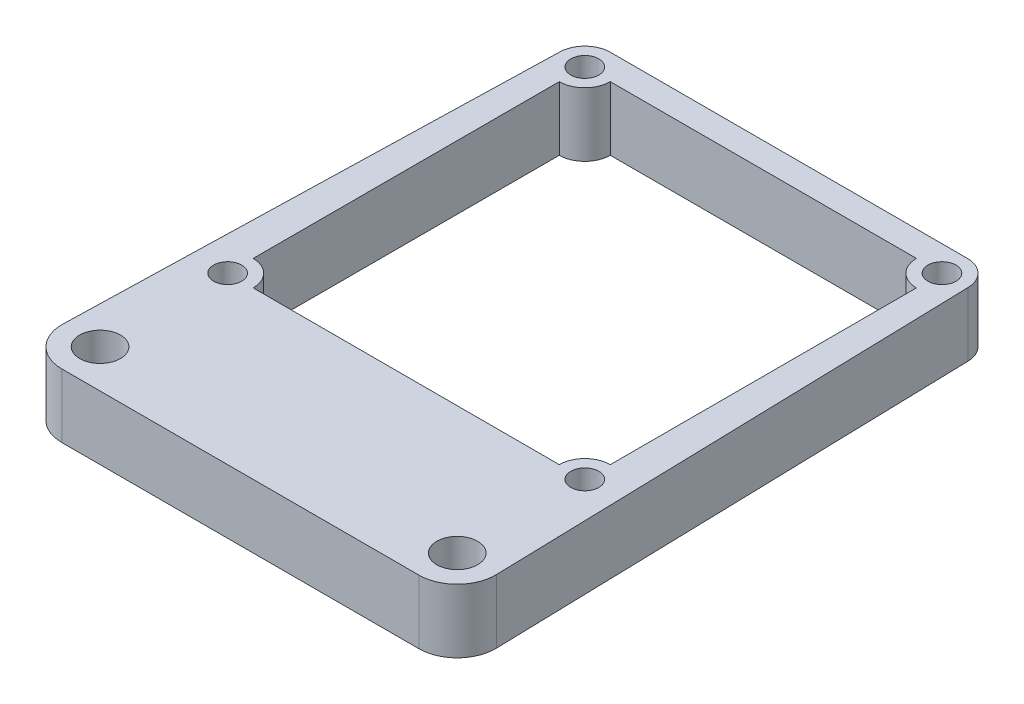
ISO-10303-21;
HEADER;
FILE_DESCRIPTION(('STEP AP214'),'2;1');
FILE_NAME('part.step','',(''),(''),'','','');
FILE_SCHEMA(('AUTOMOTIVE_DESIGN { 1 0 10303 214 1 1 1 1 }'));
ENDSEC;
DATA;
#1=APPLICATION_CONTEXT('core data for automotive mechanical design processes');
#2=APPLICATION_PROTOCOL_DEFINITION('international standard','automotive_design',2000,#1);
#3=PRODUCT_CONTEXT('',#1,'mechanical');
#4=PRODUCT('Part','Part','',(#3));
#5=PRODUCT_RELATED_PRODUCT_CATEGORY('part','',(#4));
#6=PRODUCT_DEFINITION_FORMATION('','',#4);
#7=PRODUCT_DEFINITION_CONTEXT('part definition',#1,'design');
#8=PRODUCT_DEFINITION('design','',#6,#7);
#9=PRODUCT_DEFINITION_SHAPE('','',#8);
#10=(LENGTH_UNIT() NAMED_UNIT(*) SI_UNIT(.MILLI.,.METRE.));
#11=(NAMED_UNIT(*) PLANE_ANGLE_UNIT() SI_UNIT($,.RADIAN.));
#12=(NAMED_UNIT(*) SI_UNIT($,.STERADIAN.) SOLID_ANGLE_UNIT());
#13=UNCERTAINTY_MEASURE_WITH_UNIT(LENGTH_MEASURE(1.E-05),#10,'distance_accuracy_value','');
#14=(GEOMETRIC_REPRESENTATION_CONTEXT(3) GLOBAL_UNCERTAINTY_ASSIGNED_CONTEXT((#13)) GLOBAL_UNIT_ASSIGNED_CONTEXT((#10,
#11,#12)) REPRESENTATION_CONTEXT('',''));
#15=CARTESIAN_POINT('',(0.,0.,0.));
#16=DIRECTION('',(0.,0.,1.));
#17=DIRECTION('',(1.,0.,0.));
#18=AXIS2_PLACEMENT_3D('',#15,#16,#17);
#19=CARTESIAN_POINT('',(-14.,5.,24.));
#20=DIRECTION('',(0.,1.,0.));
#21=DIRECTION('',(0.,0.,1.));
#22=AXIS2_PLACEMENT_3D('',#19,#20,#21);
#23=PLANE('',#22);
#24=CARTESIAN_POINT('',(-14.,5.,14.));
#25=DIRECTION('',(0.,1.,0.));
#26=DIRECTION('',(0.,0.,1.));
#27=AXIS2_PLACEMENT_3D('',#24,#25,#26);
#28=CIRCLE('',#27,1.1);
#29=CARTESIAN_POINT('',(-14.,5.,15.1));
#30=VERTEX_POINT('',#29);
#31=EDGE_CURVE('E217',#30,#30,#28,.T.);
#32=ORIENTED_EDGE('',*,*,#31,.F.);
#33=EDGE_LOOP('',(#32));
#34=FACE_BOUND('',#33,.T.);
#35=CARTESIAN_POINT('',(14.,5.,-14.));
#36=DIRECTION('',(0.,1.,0.));
#37=DIRECTION('',(0.,0.,1.));
#38=AXIS2_PLACEMENT_3D('',#35,#36,#37);
#39=CIRCLE('',#38,1.1);
#40=CARTESIAN_POINT('',(14.,5.,-12.9));
#41=VERTEX_POINT('',#40);
#42=EDGE_CURVE('E229',#41,#41,#39,.T.);
#43=ORIENTED_EDGE('',*,*,#42,.F.);
#44=EDGE_LOOP('',(#43));
#45=FACE_BOUND('',#44,.T.);
#46=CARTESIAN_POINT('',(-14.,5.,-14.));
#47=DIRECTION('',(0.,1.,0.));
#48=DIRECTION('',(0.,0.,1.));
#49=AXIS2_PLACEMENT_3D('',#46,#47,#48);
#50=CIRCLE('',#49,1.1);
#51=CARTESIAN_POINT('',(-14.,5.,-12.9));
#52=VERTEX_POINT('',#51);
#53=EDGE_CURVE('E241',#52,#52,#50,.T.);
#54=ORIENTED_EDGE('',*,*,#53,.F.);
#55=EDGE_LOOP('',(#54));
#56=FACE_BOUND('',#55,.T.);
#57=CARTESIAN_POINT('',(-14.,5.,24.));
#58=DIRECTION('',(0.,1.,0.));
#59=DIRECTION('',(0.,0.,1.));
#60=AXIS2_PLACEMENT_3D('',#57,#58,#59);
#61=CIRCLE('',#60,3.);
#62=CARTESIAN_POINT('',(-16.9989610389299,5.,23.9210526315789));
#63=VERTEX_POINT('',#62);
#64=CARTESIAN_POINT('',(-14.,5.,27.));
#65=VERTEX_POINT('',#64);
#66=EDGE_CURVE('E247',#63,#65,#61,.T.);
#67=ORIENTED_EDGE('',*,*,#66,.T.);
#68=DIRECTION('',(1.,0.,0.));
#69=VECTOR('',#68,1.);
#70=CARTESIAN_POINT('',(-14.,5.,27.));
#71=LINE('',#70,#69);
#72=CARTESIAN_POINT('',(14.,5.,27.));
#73=VERTEX_POINT('',#72);
#74=EDGE_CURVE('E250',#65,#73,#71,.T.);
#75=ORIENTED_EDGE('',*,*,#74,.T.);
#76=CARTESIAN_POINT('',(14.,5.,24.));
#77=DIRECTION('',(0.,1.,0.));
#78=DIRECTION('',(0.,0.,-1.));
#79=AXIS2_PLACEMENT_3D('',#76,#77,#78);
#80=CIRCLE('',#79,3.);
#81=CARTESIAN_POINT('',(16.9989610389299,5.,23.9210526315789));
#82=VERTEX_POINT('',#81);
#83=EDGE_CURVE('E253',#73,#82,#80,.T.);
#84=ORIENTED_EDGE('',*,*,#83,.T.);
#85=DIRECTION('',(-0.0263157894736841,0.,-0.999653679643294));
#86=VECTOR('',#85,1.);
#87=CARTESIAN_POINT('',(15.9993073592866,5.,-14.0526315789474));
#88=LINE('',#87,#86);
#89=CARTESIAN_POINT('',(15.9993073592866,5.,-14.0526315789474));
#90=VERTEX_POINT('',#89);
#91=EDGE_CURVE('E255',#82,#90,#88,.T.);
#92=ORIENTED_EDGE('',*,*,#91,.T.);
#93=CARTESIAN_POINT('',(14.,5.,-14.));
#94=DIRECTION('',(0.,1.,0.));
#95=DIRECTION('',(0.,0.,-1.));
#96=AXIS2_PLACEMENT_3D('',#93,#94,#95);
#97=CIRCLE('',#96,2.);
#98=CARTESIAN_POINT('',(14.,5.,-16.));
#99=VERTEX_POINT('',#98);
#100=EDGE_CURVE('E257',#90,#99,#97,.T.);
#101=ORIENTED_EDGE('',*,*,#100,.T.);
#102=DIRECTION('',(-1.,0.,0.));
#103=VECTOR('',#102,1.);
#104=CARTESIAN_POINT('',(-14.,5.,-16.));
#105=LINE('',#104,#103);
#106=CARTESIAN_POINT('',(-14.,5.,-16.));
#107=VERTEX_POINT('',#106);
#108=EDGE_CURVE('E259',#99,#107,#105,.T.);
#109=ORIENTED_EDGE('',*,*,#108,.T.);
#110=CARTESIAN_POINT('',(-14.,5.,-14.));
#111=DIRECTION('',(0.,1.,0.));
#112=DIRECTION('',(0.,0.,1.));
#113=AXIS2_PLACEMENT_3D('',#110,#111,#112);
#114=CIRCLE('',#113,2.);
#115=CARTESIAN_POINT('',(-15.9993073592866,5.,-14.0526315789474));
#116=VERTEX_POINT('',#115);
#117=EDGE_CURVE('E261',#107,#116,#114,.T.);
#118=ORIENTED_EDGE('',*,*,#117,.T.);
#119=DIRECTION('',(-0.0263157894736841,0.,0.999653679643294));
#120=VECTOR('',#119,1.);
#121=CARTESIAN_POINT('',(-15.9993073592866,5.,-14.0526315789474));
#122=LINE('',#121,#120);
#123=EDGE_CURVE('E263',#116,#63,#122,.T.);
#124=ORIENTED_EDGE('',*,*,#123,.T.);
#125=EDGE_LOOP('',(#67,#75,#84,#92,#101,#109,#118,#124));
#126=FACE_BOUND('',#125,.T.);
#127=CARTESIAN_POINT('',(-14.,5.,24.));
#128=DIRECTION('',(0.,1.,0.));
#129=DIRECTION('',(0.,0.,1.));
#130=AXIS2_PLACEMENT_3D('',#127,#128,#129);
#131=CIRCLE('',#130,1.6);
#132=CARTESIAN_POINT('',(-14.,5.,25.6));
#133=VERTEX_POINT('',#132);
#134=EDGE_CURVE('E235',#133,#133,#131,.T.);
#135=ORIENTED_EDGE('',*,*,#134,.F.);
#136=EDGE_LOOP('',(#135));
#137=FACE_BOUND('',#136,.T.);
#138=CARTESIAN_POINT('',(14.,5.,14.));
#139=DIRECTION('',(0.,1.,0.));
#140=DIRECTION('',(0.,0.,1.));
#141=AXIS2_PLACEMENT_3D('',#138,#139,#140);
#142=CIRCLE('',#141,1.1);
#143=CARTESIAN_POINT('',(14.,5.,15.1));
#144=VERTEX_POINT('',#143);
#145=EDGE_CURVE('E223',#144,#144,#142,.T.);
#146=ORIENTED_EDGE('',*,*,#145,.F.);
#147=EDGE_LOOP('',(#146));
#148=FACE_BOUND('',#147,.T.);
#149=CARTESIAN_POINT('',(14.,5.,24.));
#150=DIRECTION('',(0.,1.,0.));
#151=DIRECTION('',(0.,0.,1.));
#152=AXIS2_PLACEMENT_3D('',#149,#150,#151);
#153=CIRCLE('',#152,1.6);
#154=CARTESIAN_POINT('',(14.,5.,25.6));
#155=VERTEX_POINT('',#154);
#156=EDGE_CURVE('E211',#155,#155,#153,.T.);
#157=ORIENTED_EDGE('',*,*,#156,.F.);
#158=EDGE_LOOP('',(#157));
#159=FACE_BOUND('',#158,.T.);
#160=DIRECTION('',(0.,0.,1.));
#161=VECTOR('',#160,1.);
#162=CARTESIAN_POINT('',(-14.,5.,-12.));
#163=LINE('',#162,#161);
#164=CARTESIAN_POINT('',(-14.,5.,-12.));
#165=VERTEX_POINT('',#164);
#166=CARTESIAN_POINT('',(-14.,5.,12.));
#167=VERTEX_POINT('',#166);
#168=EDGE_CURVE('E154',#165,#167,#163,.T.);
#169=ORIENTED_EDGE('',*,*,#168,.F.);
#170=CARTESIAN_POINT('',(-14.,5.,-14.));
#171=DIRECTION('',(0.,-1.,0.));
#172=DIRECTION('',(0.,0.,1.));
#173=AXIS2_PLACEMENT_3D('',#170,#171,#172);
#174=CIRCLE('',#173,2.);
#175=CARTESIAN_POINT('',(-12.,5.,-14.));
#176=VERTEX_POINT('',#175);
#177=EDGE_CURVE('E146',#176,#165,#174,.T.);
#178=ORIENTED_EDGE('',*,*,#177,.F.);
#179=DIRECTION('',(-1.,0.,0.));
#180=VECTOR('',#179,1.);
#181=CARTESIAN_POINT('',(12.,5.,-14.));
#182=LINE('',#181,#180);
#183=CARTESIAN_POINT('',(12.,5.,-14.));
#184=VERTEX_POINT('',#183);
#185=EDGE_CURVE('E179',#184,#176,#182,.T.);
#186=ORIENTED_EDGE('',*,*,#185,.F.);
#187=CARTESIAN_POINT('',(14.,5.,-14.));
#188=DIRECTION('',(0.,-1.,0.));
#189=DIRECTION('',(0.,0.,1.));
#190=AXIS2_PLACEMENT_3D('',#187,#188,#189);
#191=CIRCLE('',#190,2.);
#192=CARTESIAN_POINT('',(14.,5.,-12.));
#193=VERTEX_POINT('',#192);
#194=EDGE_CURVE('E177',#193,#184,#191,.T.);
#195=ORIENTED_EDGE('',*,*,#194,.F.);
#196=DIRECTION('',(0.,0.,-1.));
#197=VECTOR('',#196,1.);
#198=CARTESIAN_POINT('',(14.,5.,12.));
#199=LINE('',#198,#197);
#200=CARTESIAN_POINT('',(14.,5.,12.));
#201=VERTEX_POINT('',#200);
#202=EDGE_CURVE('E175',#201,#193,#199,.T.);
#203=ORIENTED_EDGE('',*,*,#202,.F.);
#204=CARTESIAN_POINT('',(14.,5.,14.));
#205=DIRECTION('',(0.,-1.,0.));
#206=DIRECTION('',(0.,0.,1.));
#207=AXIS2_PLACEMENT_3D('',#204,#205,#206);
#208=CIRCLE('',#207,2.);
#209=CARTESIAN_POINT('',(12.,5.,14.));
#210=VERTEX_POINT('',#209);
#211=EDGE_CURVE('E173',#210,#201,#208,.T.);
#212=ORIENTED_EDGE('',*,*,#211,.F.);
#213=DIRECTION('',(1.,0.,0.));
#214=VECTOR('',#213,1.);
#215=CARTESIAN_POINT('',(-12.,5.,14.));
#216=LINE('',#215,#214);
#217=CARTESIAN_POINT('',(-12.,5.,14.));
#218=VERTEX_POINT('',#217);
#219=EDGE_CURVE('E169',#218,#210,#216,.T.);
#220=ORIENTED_EDGE('',*,*,#219,.F.);
#221=CARTESIAN_POINT('',(-14.,5.,14.));
#222=DIRECTION('',(0.,-1.,0.));
#223=DIRECTION('',(0.,0.,1.));
#224=AXIS2_PLACEMENT_3D('',#221,#222,#223);
#225=CIRCLE('',#224,2.);
#226=EDGE_CURVE('E167',#167,#218,#225,.T.);
#227=ORIENTED_EDGE('',*,*,#226,.F.);
#228=EDGE_LOOP('',(#169,#178,#186,#195,#203,#212,#220,#227));
#229=FACE_BOUND('',#228,.T.);
#230=ADVANCED_FACE('F33',(#34,#45,#56,#126,#137,#148,#159,#229),#23,.T.);
#231=CARTESIAN_POINT('',(-14.,0.,24.));
#232=DIRECTION('',(0.,1.,0.));
#233=DIRECTION('',(0.,0.,1.));
#234=AXIS2_PLACEMENT_3D('',#231,#232,#233);
#235=PLANE('',#234);
#236=CARTESIAN_POINT('',(14.,0.,24.));
#237=DIRECTION('',(0.,1.,0.));
#238=DIRECTION('',(0.,0.,1.));
#239=AXIS2_PLACEMENT_3D('',#236,#237,#238);
#240=CIRCLE('',#239,1.6);
#241=CARTESIAN_POINT('',(14.,0.,25.6));
#242=VERTEX_POINT('',#241);
#243=EDGE_CURVE('E162',#242,#242,#240,.T.);
#244=ORIENTED_EDGE('',*,*,#243,.T.);
#245=EDGE_LOOP('',(#244));
#246=FACE_BOUND('',#245,.T.);
#247=CARTESIAN_POINT('',(-14.,0.,14.));
#248=DIRECTION('',(0.,1.,0.));
#249=DIRECTION('',(0.,0.,1.));
#250=AXIS2_PLACEMENT_3D('',#247,#248,#249);
#251=CIRCLE('',#250,1.1);
#252=CARTESIAN_POINT('',(-14.,0.,15.1));
#253=VERTEX_POINT('',#252);
#254=EDGE_CURVE('E214',#253,#253,#251,.T.);
#255=ORIENTED_EDGE('',*,*,#254,.T.);
#256=EDGE_LOOP('',(#255));
#257=FACE_BOUND('',#256,.T.);
#258=CARTESIAN_POINT('',(14.,0.,14.));
#259=DIRECTION('',(0.,1.,0.));
#260=DIRECTION('',(0.,0.,1.));
#261=AXIS2_PLACEMENT_3D('',#258,#259,#260);
#262=CIRCLE('',#261,1.1);
#263=CARTESIAN_POINT('',(14.,0.,15.1));
#264=VERTEX_POINT('',#263);
#265=EDGE_CURVE('E220',#264,#264,#262,.T.);
#266=ORIENTED_EDGE('',*,*,#265,.T.);
#267=EDGE_LOOP('',(#266));
#268=FACE_BOUND('',#267,.T.);
#269=CARTESIAN_POINT('',(14.,0.,-14.));
#270=DIRECTION('',(0.,1.,0.));
#271=DIRECTION('',(0.,0.,1.));
#272=AXIS2_PLACEMENT_3D('',#269,#270,#271);
#273=CIRCLE('',#272,1.1);
#274=CARTESIAN_POINT('',(14.,0.,-12.9));
#275=VERTEX_POINT('',#274);
#276=EDGE_CURVE('E226',#275,#275,#273,.T.);
#277=ORIENTED_EDGE('',*,*,#276,.T.);
#278=EDGE_LOOP('',(#277));
#279=FACE_BOUND('',#278,.T.);
#280=CARTESIAN_POINT('',(-14.,0.,24.));
#281=DIRECTION('',(0.,1.,0.));
#282=DIRECTION('',(0.,0.,1.));
#283=AXIS2_PLACEMENT_3D('',#280,#281,#282);
#284=CIRCLE('',#283,1.6);
#285=CARTESIAN_POINT('',(-14.,0.,25.6));
#286=VERTEX_POINT('',#285);
#287=EDGE_CURVE('E232',#286,#286,#284,.T.);
#288=ORIENTED_EDGE('',*,*,#287,.T.);
#289=EDGE_LOOP('',(#288));
#290=FACE_BOUND('',#289,.T.);
#291=CARTESIAN_POINT('',(-14.,0.,-14.));
#292=DIRECTION('',(0.,1.,0.));
#293=DIRECTION('',(0.,0.,1.));
#294=AXIS2_PLACEMENT_3D('',#291,#292,#293);
#295=CIRCLE('',#294,1.1);
#296=CARTESIAN_POINT('',(-14.,0.,-12.9));
#297=VERTEX_POINT('',#296);
#298=EDGE_CURVE('E238',#297,#297,#295,.T.);
#299=ORIENTED_EDGE('',*,*,#298,.T.);
#300=EDGE_LOOP('',(#299));
#301=FACE_BOUND('',#300,.T.);
#302=CARTESIAN_POINT('',(-14.,0.,24.));
#303=DIRECTION('',(0.,1.,0.));
#304=DIRECTION('',(0.,0.,1.));
#305=AXIS2_PLACEMENT_3D('',#302,#303,#304);
#306=CIRCLE('',#305,3.);
#307=CARTESIAN_POINT('',(-16.9989610389299,0.,23.9210526315789));
#308=VERTEX_POINT('',#307);
#309=CARTESIAN_POINT('',(-14.,0.,27.));
#310=VERTEX_POINT('',#309);
#311=EDGE_CURVE('E244',#308,#310,#306,.T.);
#312=ORIENTED_EDGE('',*,*,#311,.F.);
#313=DIRECTION('',(-0.0263157894736841,0.,0.999653679643294));
#314=VECTOR('',#313,1.);
#315=CARTESIAN_POINT('',(-15.9993073592866,0.,-14.0526315789474));
#316=LINE('',#315,#314);
#317=CARTESIAN_POINT('',(-15.9993073592866,0.,-14.0526315789474));
#318=VERTEX_POINT('',#317);
#319=EDGE_CURVE('E251',#318,#308,#316,.T.);
#320=ORIENTED_EDGE('',*,*,#319,.F.);
#321=CARTESIAN_POINT('',(-14.,0.,-14.));
#322=DIRECTION('',(0.,1.,0.));
#323=DIRECTION('',(0.,0.,1.));
#324=AXIS2_PLACEMENT_3D('',#321,#322,#323);
#325=CIRCLE('',#324,2.);
#326=CARTESIAN_POINT('',(-14.,0.,-16.));
#327=VERTEX_POINT('',#326);
#328=EDGE_CURVE('E278',#327,#318,#325,.T.);
#329=ORIENTED_EDGE('',*,*,#328,.F.);
#330=DIRECTION('',(-1.,0.,0.));
#331=VECTOR('',#330,1.);
#332=CARTESIAN_POINT('',(-14.,0.,-16.));
#333=LINE('',#332,#331);
#334=CARTESIAN_POINT('',(14.,0.,-16.));
#335=VERTEX_POINT('',#334);
#336=EDGE_CURVE('E276',#335,#327,#333,.T.);
#337=ORIENTED_EDGE('',*,*,#336,.F.);
#338=CARTESIAN_POINT('',(14.,0.,-14.));
#339=DIRECTION('',(0.,1.,0.));
#340=DIRECTION('',(0.,0.,-1.));
#341=AXIS2_PLACEMENT_3D('',#338,#339,#340);
#342=CIRCLE('',#341,2.);
#343=CARTESIAN_POINT('',(15.9993073592866,0.,-14.0526315789474));
#344=VERTEX_POINT('',#343);
#345=EDGE_CURVE('E274',#344,#335,#342,.T.);
#346=ORIENTED_EDGE('',*,*,#345,.F.);
#347=DIRECTION('',(-0.0263157894736841,0.,-0.999653679643294));
#348=VECTOR('',#347,1.);
#349=CARTESIAN_POINT('',(15.9993073592866,0.,-14.0526315789474));
#350=LINE('',#349,#348);
#351=CARTESIAN_POINT('',(16.9989610389299,0.,23.9210526315789));
#352=VERTEX_POINT('',#351);
#353=EDGE_CURVE('E272',#352,#344,#350,.T.);
#354=ORIENTED_EDGE('',*,*,#353,.F.);
#355=CARTESIAN_POINT('',(14.,0.,24.));
#356=DIRECTION('',(0.,1.,0.));
#357=DIRECTION('',(0.,0.,-1.));
#358=AXIS2_PLACEMENT_3D('',#355,#356,#357);
#359=CIRCLE('',#358,3.);
#360=CARTESIAN_POINT('',(14.,0.,27.));
#361=VERTEX_POINT('',#360);
#362=EDGE_CURVE('E270',#361,#352,#359,.T.);
#363=ORIENTED_EDGE('',*,*,#362,.F.);
#364=DIRECTION('',(1.,0.,0.));
#365=VECTOR('',#364,1.);
#366=CARTESIAN_POINT('',(-14.,0.,27.));
#367=LINE('',#366,#365);
#368=EDGE_CURVE('E268',#310,#361,#367,.T.);
#369=ORIENTED_EDGE('',*,*,#368,.F.);
#370=EDGE_LOOP('',(#312,#320,#329,#337,#346,#354,#363,#369));
#371=FACE_BOUND('',#370,.T.);
#372=CARTESIAN_POINT('',(-14.,0.,-14.));
#373=DIRECTION('',(0.,-1.,0.));
#374=DIRECTION('',(0.,0.,1.));
#375=AXIS2_PLACEMENT_3D('',#372,#373,#374);
#376=CIRCLE('',#375,2.);
#377=CARTESIAN_POINT('',(-12.,0.,-14.));
#378=VERTEX_POINT('',#377);
#379=CARTESIAN_POINT('',(-14.,0.,-12.));
#380=VERTEX_POINT('',#379);
#381=EDGE_CURVE('E56',#378,#380,#376,.T.);
#382=ORIENTED_EDGE('',*,*,#381,.T.);
#383=DIRECTION('',(0.,0.,1.));
#384=VECTOR('',#383,1.);
#385=CARTESIAN_POINT('',(-14.,0.,-12.));
#386=LINE('',#385,#384);
#387=CARTESIAN_POINT('',(-14.,0.,12.));
#388=VERTEX_POINT('',#387);
#389=EDGE_CURVE('E161',#380,#388,#386,.T.);
#390=ORIENTED_EDGE('',*,*,#389,.T.);
#391=CARTESIAN_POINT('',(-14.,0.,14.));
#392=DIRECTION('',(0.,-1.,0.));
#393=DIRECTION('',(0.,0.,1.));
#394=AXIS2_PLACEMENT_3D('',#391,#392,#393);
#395=CIRCLE('',#394,2.);
#396=CARTESIAN_POINT('',(-12.,0.,14.));
#397=VERTEX_POINT('',#396);
#398=EDGE_CURVE('E183',#388,#397,#395,.T.);
#399=ORIENTED_EDGE('',*,*,#398,.T.);
#400=DIRECTION('',(1.,0.,0.));
#401=VECTOR('',#400,1.);
#402=CARTESIAN_POINT('',(-12.,0.,14.));
#403=LINE('',#402,#401);
#404=CARTESIAN_POINT('',(12.,0.,14.));
#405=VERTEX_POINT('',#404);
#406=EDGE_CURVE('E186',#397,#405,#403,.T.);
#407=ORIENTED_EDGE('',*,*,#406,.T.);
#408=CARTESIAN_POINT('',(14.,0.,14.));
#409=DIRECTION('',(0.,-1.,0.));
#410=DIRECTION('',(0.,0.,1.));
#411=AXIS2_PLACEMENT_3D('',#408,#409,#410);
#412=CIRCLE('',#411,2.);
#413=CARTESIAN_POINT('',(14.,0.,12.));
#414=VERTEX_POINT('',#413);
#415=EDGE_CURVE('E189',#405,#414,#412,.T.);
#416=ORIENTED_EDGE('',*,*,#415,.T.);
#417=DIRECTION('',(0.,0.,-1.));
#418=VECTOR('',#417,1.);
#419=CARTESIAN_POINT('',(14.,0.,12.));
#420=LINE('',#419,#418);
#421=CARTESIAN_POINT('',(14.,0.,-12.));
#422=VERTEX_POINT('',#421);
#423=EDGE_CURVE('E192',#414,#422,#420,.T.);
#424=ORIENTED_EDGE('',*,*,#423,.T.);
#425=CARTESIAN_POINT('',(14.,0.,-14.));
#426=DIRECTION('',(0.,-1.,0.));
#427=DIRECTION('',(0.,0.,1.));
#428=AXIS2_PLACEMENT_3D('',#425,#426,#427);
#429=CIRCLE('',#428,2.);
#430=CARTESIAN_POINT('',(12.,0.,-14.));
#431=VERTEX_POINT('',#430);
#432=EDGE_CURVE('E195',#422,#431,#429,.T.);
#433=ORIENTED_EDGE('',*,*,#432,.T.);
#434=DIRECTION('',(-1.,0.,0.));
#435=VECTOR('',#434,1.);
#436=CARTESIAN_POINT('',(12.,0.,-14.));
#437=LINE('',#436,#435);
#438=EDGE_CURVE('E155',#431,#378,#437,.T.);
#439=ORIENTED_EDGE('',*,*,#438,.T.);
#440=EDGE_LOOP('',(#382,#390,#399,#407,#416,#424,#433,#439));
#441=FACE_BOUND('',#440,.T.);
#442=ADVANCED_FACE('F308',(#246,#257,#268,#279,#290,#301,#371,#441),#235,.F.);
#443=CARTESIAN_POINT('',(-14.,5.,24.));
#444=DIRECTION('',(0.,-1.,0.));
#445=DIRECTION('',(0.,0.,-1.));
#446=AXIS2_PLACEMENT_3D('',#443,#444,#445);
#447=CYLINDRICAL_SURFACE('',#446,3.);
#448=ORIENTED_EDGE('',*,*,#311,.T.);
#449=DIRECTION('',(0.,-1.,0.));
#450=VECTOR('',#449,1.);
#451=CARTESIAN_POINT('',(-14.,5.,27.));
#452=LINE('',#451,#450);
#453=EDGE_CURVE('E11',#65,#310,#452,.T.);
#454=ORIENTED_EDGE('',*,*,#453,.F.);
#455=ORIENTED_EDGE('',*,*,#66,.F.);
#456=DIRECTION('',(0.,-1.,0.));
#457=VECTOR('',#456,1.);
#458=CARTESIAN_POINT('',(-16.9989610389299,5.,23.9210526315789));
#459=LINE('',#458,#457);
#460=EDGE_CURVE('E265',#63,#308,#459,.T.);
#461=ORIENTED_EDGE('',*,*,#460,.T.);
#462=EDGE_LOOP('',(#448,#454,#455,#461));
#463=FACE_BOUND('',#462,.T.);
#464=ADVANCED_FACE('F35',(#463),#447,.T.);
#465=CARTESIAN_POINT('',(-14.,5.,27.));
#466=DIRECTION('',(0.,0.,-1.));
#467=DIRECTION('',(-1.,0.,0.));
#468=AXIS2_PLACEMENT_3D('',#465,#466,#467);
#469=PLANE('',#468);
#470=ORIENTED_EDGE('',*,*,#368,.T.);
#471=DIRECTION('',(0.,-1.,0.));
#472=VECTOR('',#471,1.);
#473=CARTESIAN_POINT('',(14.,5.,27.));
#474=LINE('',#473,#472);
#475=EDGE_CURVE('E41',#73,#361,#474,.T.);
#476=ORIENTED_EDGE('',*,*,#475,.F.);
#477=ORIENTED_EDGE('',*,*,#74,.F.);
#478=ORIENTED_EDGE('',*,*,#453,.T.);
#479=EDGE_LOOP('',(#470,#476,#477,#478));
#480=FACE_BOUND('',#479,.T.);
#481=ADVANCED_FACE('F326',(#480),#469,.F.);
#482=CARTESIAN_POINT('',(14.,5.,24.));
#483=DIRECTION('',(0.,-1.,0.));
#484=DIRECTION('',(0.,0.,-1.));
#485=AXIS2_PLACEMENT_3D('',#482,#483,#484);
#486=CYLINDRICAL_SURFACE('',#485,3.);
#487=ORIENTED_EDGE('',*,*,#362,.T.);
#488=DIRECTION('',(0.,-1.,0.));
#489=VECTOR('',#488,1.);
#490=CARTESIAN_POINT('',(16.9989610389299,5.,23.9210526315789));
#491=LINE('',#490,#489);
#492=EDGE_CURVE('E295',#82,#352,#491,.T.);
#493=ORIENTED_EDGE('',*,*,#492,.F.);
#494=ORIENTED_EDGE('',*,*,#83,.F.);
#495=ORIENTED_EDGE('',*,*,#475,.T.);
#496=EDGE_LOOP('',(#487,#493,#494,#495));
#497=FACE_BOUND('',#496,.T.);
#498=ADVANCED_FACE('F302',(#497),#486,.T.);
#499=CARTESIAN_POINT('',(15.9993073592866,5.,-14.0526315789474));
#500=DIRECTION('',(-0.999653679643294,0.,0.0263157894736841));
#501=DIRECTION('',(0.0263157894736841,0.,0.999653679643294));
#502=AXIS2_PLACEMENT_3D('',#499,#500,#501);
#503=PLANE('',#502);
#504=ORIENTED_EDGE('',*,*,#353,.T.);
#505=DIRECTION('',(0.,-1.,0.));
#506=VECTOR('',#505,1.);
#507=CARTESIAN_POINT('',(15.9993073592866,5.,-14.0526315789474));
#508=LINE('',#507,#506);
#509=EDGE_CURVE('E292',#90,#344,#508,.T.);
#510=ORIENTED_EDGE('',*,*,#509,.F.);
#511=ORIENTED_EDGE('',*,*,#91,.F.);
#512=ORIENTED_EDGE('',*,*,#492,.T.);
#513=EDGE_LOOP('',(#504,#510,#511,#512));
#514=FACE_BOUND('',#513,.T.);
#515=ADVANCED_FACE('F314',(#514),#503,.F.);
#516=CARTESIAN_POINT('',(14.,5.,-14.));
#517=DIRECTION('',(0.,-1.,0.));
#518=DIRECTION('',(0.,0.,-1.));
#519=AXIS2_PLACEMENT_3D('',#516,#517,#518);
#520=CYLINDRICAL_SURFACE('',#519,2.);
#521=ORIENTED_EDGE('',*,*,#345,.T.);
#522=DIRECTION('',(0.,-1.,0.));
#523=VECTOR('',#522,1.);
#524=CARTESIAN_POINT('',(14.,5.,-16.));
#525=LINE('',#524,#523);
#526=EDGE_CURVE('E289',#99,#335,#525,.T.);
#527=ORIENTED_EDGE('',*,*,#526,.F.);
#528=ORIENTED_EDGE('',*,*,#100,.F.);
#529=ORIENTED_EDGE('',*,*,#509,.T.);
#530=EDGE_LOOP('',(#521,#527,#528,#529));
#531=FACE_BOUND('',#530,.T.);
#532=ADVANCED_FACE('F318',(#531),#520,.T.);
#533=CARTESIAN_POINT('',(-14.,5.,-16.));
#534=DIRECTION('',(0.,0.,1.));
#535=DIRECTION('',(1.,0.,0.));
#536=AXIS2_PLACEMENT_3D('',#533,#534,#535);
#537=PLANE('',#536);
#538=ORIENTED_EDGE('',*,*,#336,.T.);
#539=DIRECTION('',(0.,-1.,0.));
#540=VECTOR('',#539,1.);
#541=CARTESIAN_POINT('',(-14.,5.,-16.));
#542=LINE('',#541,#540);
#543=EDGE_CURVE('E286',#107,#327,#542,.T.);
#544=ORIENTED_EDGE('',*,*,#543,.F.);
#545=ORIENTED_EDGE('',*,*,#108,.F.);
#546=ORIENTED_EDGE('',*,*,#526,.T.);
#547=EDGE_LOOP('',(#538,#544,#545,#546));
#548=FACE_BOUND('',#547,.T.);
#549=ADVANCED_FACE('F339',(#548),#537,.F.);
#550=CARTESIAN_POINT('',(-14.,5.,-14.));
#551=DIRECTION('',(0.,-1.,0.));
#552=DIRECTION('',(0.,0.,-1.));
#553=AXIS2_PLACEMENT_3D('',#550,#551,#552);
#554=CYLINDRICAL_SURFACE('',#553,2.);
#555=ORIENTED_EDGE('',*,*,#328,.T.);
#556=DIRECTION('',(0.,-1.,0.));
#557=VECTOR('',#556,1.);
#558=CARTESIAN_POINT('',(-15.9993073592866,5.,-14.0526315789474));
#559=LINE('',#558,#557);
#560=EDGE_CURVE('E283',#116,#318,#559,.T.);
#561=ORIENTED_EDGE('',*,*,#560,.F.);
#562=ORIENTED_EDGE('',*,*,#117,.F.);
#563=ORIENTED_EDGE('',*,*,#543,.T.);
#564=EDGE_LOOP('',(#555,#561,#562,#563));
#565=FACE_BOUND('',#564,.T.);
#566=ADVANCED_FACE('F337',(#565),#554,.T.);
#567=CARTESIAN_POINT('',(-15.9993073592866,5.,-14.0526315789474));
#568=DIRECTION('',(0.999653679643294,0.,0.0263157894736841));
#569=DIRECTION('',(0.0263157894736841,0.,-0.999653679643294));
#570=AXIS2_PLACEMENT_3D('',#567,#568,#569);
#571=PLANE('',#570);
#572=ORIENTED_EDGE('',*,*,#319,.T.);
#573=ORIENTED_EDGE('',*,*,#460,.F.);
#574=ORIENTED_EDGE('',*,*,#123,.F.);
#575=ORIENTED_EDGE('',*,*,#560,.T.);
#576=EDGE_LOOP('',(#572,#573,#574,#575));
#577=FACE_BOUND('',#576,.T.);
#578=ADVANCED_FACE('F332',(#577),#571,.F.);
#579=CARTESIAN_POINT('',(-14.,5.,-14.));
#580=DIRECTION('',(0.,-1.,0.));
#581=DIRECTION('',(0.,0.,-1.));
#582=AXIS2_PLACEMENT_3D('',#579,#580,#581);
#583=CYLINDRICAL_SURFACE('',#582,1.1);
#584=ORIENTED_EDGE('',*,*,#53,.T.);
#585=EDGE_LOOP('',(#584));
#586=FACE_BOUND('',#585,.T.);
#587=ORIENTED_EDGE('',*,*,#298,.F.);
#588=EDGE_LOOP('',(#587));
#589=FACE_BOUND('',#588,.T.);
#590=ADVANCED_FACE('F359',(#586,#589),#583,.F.);
#591=CARTESIAN_POINT('',(-14.,5.,24.));
#592=DIRECTION('',(0.,-1.,0.));
#593=DIRECTION('',(0.,0.,-1.));
#594=AXIS2_PLACEMENT_3D('',#591,#592,#593);
#595=CYLINDRICAL_SURFACE('',#594,1.6);
#596=ORIENTED_EDGE('',*,*,#134,.T.);
#597=EDGE_LOOP('',(#596));
#598=FACE_BOUND('',#597,.T.);
#599=ORIENTED_EDGE('',*,*,#287,.F.);
#600=EDGE_LOOP('',(#599));
#601=FACE_BOUND('',#600,.T.);
#602=ADVANCED_FACE('F366',(#598,#601),#595,.F.);
#603=CARTESIAN_POINT('',(14.,5.,-14.));
#604=DIRECTION('',(0.,-1.,0.));
#605=DIRECTION('',(0.,0.,-1.));
#606=AXIS2_PLACEMENT_3D('',#603,#604,#605);
#607=CYLINDRICAL_SURFACE('',#606,1.1);
#608=ORIENTED_EDGE('',*,*,#42,.T.);
#609=EDGE_LOOP('',(#608));
#610=FACE_BOUND('',#609,.T.);
#611=ORIENTED_EDGE('',*,*,#276,.F.);
#612=EDGE_LOOP('',(#611));
#613=FACE_BOUND('',#612,.T.);
#614=ADVANCED_FACE('F371',(#610,#613),#607,.F.);
#615=CARTESIAN_POINT('',(14.,5.,14.));
#616=DIRECTION('',(0.,-1.,0.));
#617=DIRECTION('',(0.,0.,-1.));
#618=AXIS2_PLACEMENT_3D('',#615,#616,#617);
#619=CYLINDRICAL_SURFACE('',#618,1.1);
#620=ORIENTED_EDGE('',*,*,#145,.T.);
#621=EDGE_LOOP('',(#620));
#622=FACE_BOUND('',#621,.T.);
#623=ORIENTED_EDGE('',*,*,#265,.F.);
#624=EDGE_LOOP('',(#623));
#625=FACE_BOUND('',#624,.T.);
#626=ADVANCED_FACE('F381',(#622,#625),#619,.F.);
#627=CARTESIAN_POINT('',(-14.,5.,14.));
#628=DIRECTION('',(0.,-1.,0.));
#629=DIRECTION('',(0.,0.,-1.));
#630=AXIS2_PLACEMENT_3D('',#627,#628,#629);
#631=CYLINDRICAL_SURFACE('',#630,1.1);
#632=ORIENTED_EDGE('',*,*,#31,.T.);
#633=EDGE_LOOP('',(#632));
#634=FACE_BOUND('',#633,.T.);
#635=ORIENTED_EDGE('',*,*,#254,.F.);
#636=EDGE_LOOP('',(#635));
#637=FACE_BOUND('',#636,.T.);
#638=ADVANCED_FACE('F388',(#634,#637),#631,.F.);
#639=CARTESIAN_POINT('',(14.,5.,24.));
#640=DIRECTION('',(0.,-1.,0.));
#641=DIRECTION('',(0.,0.,-1.));
#642=AXIS2_PLACEMENT_3D('',#639,#640,#641);
#643=CYLINDRICAL_SURFACE('',#642,1.6);
#644=ORIENTED_EDGE('',*,*,#156,.T.);
#645=EDGE_LOOP('',(#644));
#646=FACE_BOUND('',#645,.T.);
#647=ORIENTED_EDGE('',*,*,#243,.F.);
#648=EDGE_LOOP('',(#647));
#649=FACE_BOUND('',#648,.T.);
#650=ADVANCED_FACE('F392',(#646,#649),#643,.F.);
#651=CARTESIAN_POINT('',(-14.,5.,-14.));
#652=DIRECTION('',(0.,-1.,0.));
#653=DIRECTION('',(0.,0.,-1.));
#654=AXIS2_PLACEMENT_3D('',#651,#652,#653);
#655=CYLINDRICAL_SURFACE('',#654,2.);
#656=ORIENTED_EDGE('',*,*,#381,.F.);
#657=DIRECTION('',(0.,-1.,0.));
#658=VECTOR('',#657,1.);
#659=CARTESIAN_POINT('',(-12.,5.,-14.));
#660=LINE('',#659,#658);
#661=EDGE_CURVE('E150',#176,#378,#660,.T.);
#662=ORIENTED_EDGE('',*,*,#661,.F.);
#663=ORIENTED_EDGE('',*,*,#177,.T.);
#664=DIRECTION('',(0.,-1.,0.));
#665=VECTOR('',#664,1.);
#666=CARTESIAN_POINT('',(-14.,5.,-12.));
#667=LINE('',#666,#665);
#668=EDGE_CURVE('E149',#165,#380,#667,.T.);
#669=ORIENTED_EDGE('',*,*,#668,.T.);
#670=EDGE_LOOP('',(#656,#662,#663,#669));
#671=FACE_BOUND('',#670,.T.);
#672=ADVANCED_FACE('F148',(#671),#655,.T.);
#673=CARTESIAN_POINT('',(-14.,5.,-12.));
#674=DIRECTION('',(1.,0.,0.));
#675=DIRECTION('',(0.,0.,-1.));
#676=AXIS2_PLACEMENT_3D('',#673,#674,#675);
#677=PLANE('',#676);
#678=ORIENTED_EDGE('',*,*,#389,.F.);
#679=ORIENTED_EDGE('',*,*,#668,.F.);
#680=ORIENTED_EDGE('',*,*,#168,.T.);
#681=DIRECTION('',(0.,-1.,0.));
#682=VECTOR('',#681,1.);
#683=CARTESIAN_POINT('',(-14.,5.,12.));
#684=LINE('',#683,#682);
#685=EDGE_CURVE('E163',#167,#388,#684,.T.);
#686=ORIENTED_EDGE('',*,*,#685,.T.);
#687=EDGE_LOOP('',(#678,#679,#680,#686));
#688=FACE_BOUND('',#687,.T.);
#689=ADVANCED_FACE('F158',(#688),#677,.T.);
#690=CARTESIAN_POINT('',(-14.,5.,14.));
#691=DIRECTION('',(0.,-1.,0.));
#692=DIRECTION('',(0.,0.,-1.));
#693=AXIS2_PLACEMENT_3D('',#690,#691,#692);
#694=CYLINDRICAL_SURFACE('',#693,2.);
#695=ORIENTED_EDGE('',*,*,#398,.F.);
#696=ORIENTED_EDGE('',*,*,#685,.F.);
#697=ORIENTED_EDGE('',*,*,#226,.T.);
#698=DIRECTION('',(0.,-1.,0.));
#699=VECTOR('',#698,1.);
#700=CARTESIAN_POINT('',(-12.,5.,14.));
#701=LINE('',#700,#699);
#702=EDGE_CURVE('E208',#218,#397,#701,.T.);
#703=ORIENTED_EDGE('',*,*,#702,.T.);
#704=EDGE_LOOP('',(#695,#696,#697,#703));
#705=FACE_BOUND('',#704,.T.);
#706=ADVANCED_FACE('F401',(#705),#694,.T.);
#707=CARTESIAN_POINT('',(-12.,5.,14.));
#708=DIRECTION('',(0.,0.,-1.));
#709=DIRECTION('',(-1.,0.,0.));
#710=AXIS2_PLACEMENT_3D('',#707,#708,#709);
#711=PLANE('',#710);
#712=ORIENTED_EDGE('',*,*,#406,.F.);
#713=ORIENTED_EDGE('',*,*,#702,.F.);
#714=ORIENTED_EDGE('',*,*,#219,.T.);
#715=DIRECTION('',(0.,-1.,0.));
#716=VECTOR('',#715,1.);
#717=CARTESIAN_POINT('',(12.,5.,14.));
#718=LINE('',#717,#716);
#719=EDGE_CURVE('E206',#210,#405,#718,.T.);
#720=ORIENTED_EDGE('',*,*,#719,.T.);
#721=EDGE_LOOP('',(#712,#713,#714,#720));
#722=FACE_BOUND('',#721,.T.);
#723=ADVANCED_FACE('F404',(#722),#711,.T.);
#724=CARTESIAN_POINT('',(14.,5.,14.));
#725=DIRECTION('',(0.,-1.,0.));
#726=DIRECTION('',(0.,0.,-1.));
#727=AXIS2_PLACEMENT_3D('',#724,#725,#726);
#728=CYLINDRICAL_SURFACE('',#727,2.);
#729=ORIENTED_EDGE('',*,*,#415,.F.);
#730=ORIENTED_EDGE('',*,*,#719,.F.);
#731=ORIENTED_EDGE('',*,*,#211,.T.);
#732=DIRECTION('',(0.,-1.,0.));
#733=VECTOR('',#732,1.);
#734=CARTESIAN_POINT('',(14.,5.,12.));
#735=LINE('',#734,#733);
#736=EDGE_CURVE('E204',#201,#414,#735,.T.);
#737=ORIENTED_EDGE('',*,*,#736,.T.);
#738=EDGE_LOOP('',(#729,#730,#731,#737));
#739=FACE_BOUND('',#738,.T.);
#740=ADVANCED_FACE('F408',(#739),#728,.T.);
#741=CARTESIAN_POINT('',(14.,5.,12.));
#742=DIRECTION('',(-1.,0.,0.));
#743=DIRECTION('',(0.,0.,1.));
#744=AXIS2_PLACEMENT_3D('',#741,#742,#743);
#745=PLANE('',#744);
#746=ORIENTED_EDGE('',*,*,#423,.F.);
#747=ORIENTED_EDGE('',*,*,#736,.F.);
#748=ORIENTED_EDGE('',*,*,#202,.T.);
#749=DIRECTION('',(0.,-1.,0.));
#750=VECTOR('',#749,1.);
#751=CARTESIAN_POINT('',(14.,5.,-12.));
#752=LINE('',#751,#750);
#753=EDGE_CURVE('E202',#193,#422,#752,.T.);
#754=ORIENTED_EDGE('',*,*,#753,.T.);
#755=EDGE_LOOP('',(#746,#747,#748,#754));
#756=FACE_BOUND('',#755,.T.);
#757=ADVANCED_FACE('F412',(#756),#745,.T.);
#758=CARTESIAN_POINT('',(14.,5.,-14.));
#759=DIRECTION('',(0.,-1.,0.));
#760=DIRECTION('',(0.,0.,-1.));
#761=AXIS2_PLACEMENT_3D('',#758,#759,#760);
#762=CYLINDRICAL_SURFACE('',#761,2.);
#763=ORIENTED_EDGE('',*,*,#432,.F.);
#764=ORIENTED_EDGE('',*,*,#753,.F.);
#765=ORIENTED_EDGE('',*,*,#194,.T.);
#766=DIRECTION('',(0.,-1.,0.));
#767=VECTOR('',#766,1.);
#768=CARTESIAN_POINT('',(12.,5.,-14.));
#769=LINE('',#768,#767);
#770=EDGE_CURVE('E48',#184,#431,#769,.T.);
#771=ORIENTED_EDGE('',*,*,#770,.T.);
#772=EDGE_LOOP('',(#763,#764,#765,#771));
#773=FACE_BOUND('',#772,.T.);
#774=ADVANCED_FACE('F416',(#773),#762,.T.);
#775=CARTESIAN_POINT('',(12.,5.,-14.));
#776=DIRECTION('',(0.,0.,1.));
#777=DIRECTION('',(1.,0.,0.));
#778=AXIS2_PLACEMENT_3D('',#775,#776,#777);
#779=PLANE('',#778);
#780=ORIENTED_EDGE('',*,*,#438,.F.);
#781=ORIENTED_EDGE('',*,*,#770,.F.);
#782=ORIENTED_EDGE('',*,*,#185,.T.);
#783=ORIENTED_EDGE('',*,*,#661,.T.);
#784=EDGE_LOOP('',(#780,#781,#782,#783));
#785=FACE_BOUND('',#784,.T.);
#786=ADVANCED_FACE('F420',(#785),#779,.T.);
#787=CLOSED_SHELL('',(#230,#442,#464,#481,#498,#515,#532,#549,#566,#578,#590,#602,#614,#626,
#638,#650,#672,#689,#706,#723,#740,#757,#774,#786));
#788=MANIFOLD_SOLID_BREP('B2',#787);
#789=ADVANCED_BREP_SHAPE_REPRESENTATION('',(#18,#788),#14);
#790=SHAPE_DEFINITION_REPRESENTATION(#9,#789);
ENDSEC;
END-ISO-10303-21;
